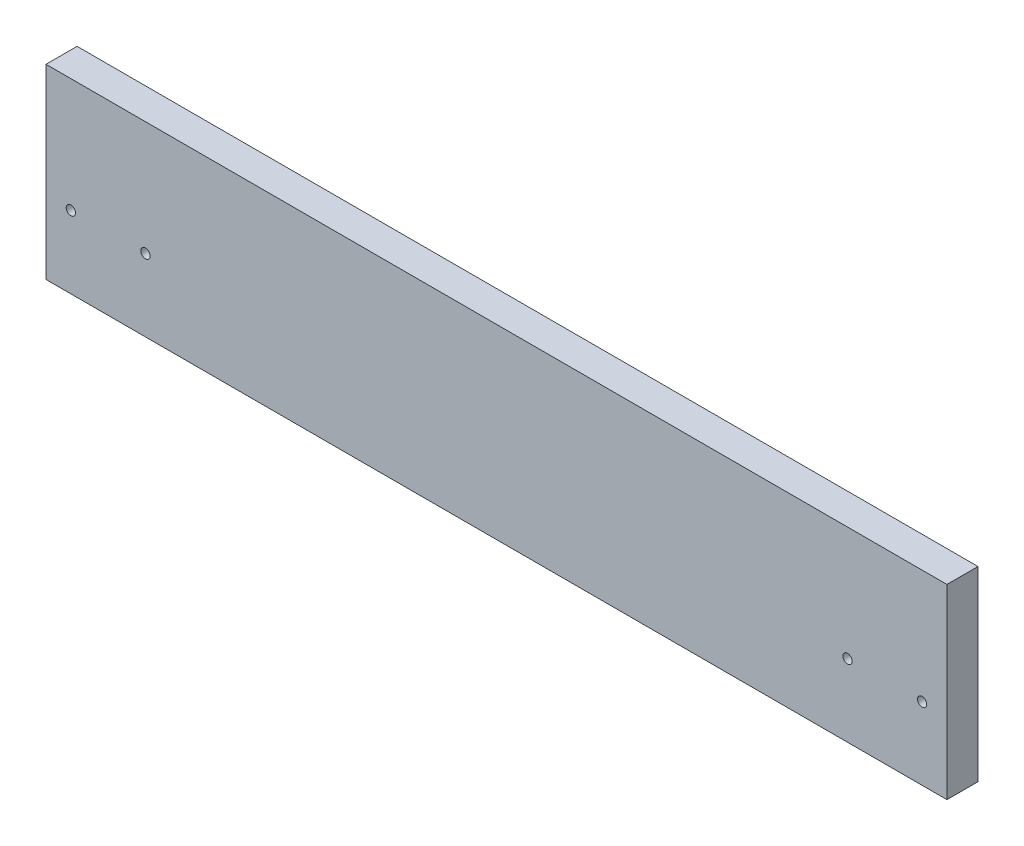
ISO-10303-21;
HEADER;
FILE_DESCRIPTION(('STEP AP214'),'2;1');
FILE_NAME('part.step','',(''),(''),'','','');
FILE_SCHEMA(('AUTOMOTIVE_DESIGN { 1 0 10303 214 1 1 1 1 }'));
ENDSEC;
DATA;
#1=APPLICATION_CONTEXT('core data for automotive mechanical design processes');
#2=APPLICATION_PROTOCOL_DEFINITION('international standard','automotive_design',2000,#1);
#3=PRODUCT_CONTEXT('',#1,'mechanical');
#4=PRODUCT('Part','Part','',(#3));
#5=PRODUCT_RELATED_PRODUCT_CATEGORY('part','',(#4));
#6=PRODUCT_DEFINITION_FORMATION('','',#4);
#7=PRODUCT_DEFINITION_CONTEXT('part definition',#1,'design');
#8=PRODUCT_DEFINITION('design','',#6,#7);
#9=PRODUCT_DEFINITION_SHAPE('','',#8);
#10=(LENGTH_UNIT() NAMED_UNIT(*) SI_UNIT(.MILLI.,.METRE.));
#11=(NAMED_UNIT(*) PLANE_ANGLE_UNIT() SI_UNIT($,.RADIAN.));
#12=(NAMED_UNIT(*) SI_UNIT($,.STERADIAN.) SOLID_ANGLE_UNIT());
#13=UNCERTAINTY_MEASURE_WITH_UNIT(LENGTH_MEASURE(1.E-05),#10,'distance_accuracy_value','');
#14=(GEOMETRIC_REPRESENTATION_CONTEXT(3) GLOBAL_UNCERTAINTY_ASSIGNED_CONTEXT((#13)) GLOBAL_UNIT_ASSIGNED_CONTEXT((#10,
#11,#12)) REPRESENTATION_CONTEXT('',''));
#15=CARTESIAN_POINT('',(0.,0.,0.));
#16=DIRECTION('',(0.,0.,1.));
#17=DIRECTION('',(1.,0.,0.));
#18=AXIS2_PLACEMENT_3D('',#15,#16,#17);
#19=CARTESIAN_POINT('',(0.,0.,10.));
#20=DIRECTION('',(1.,0.,0.));
#21=DIRECTION('',(0.,0.,-1.));
#22=AXIS2_PLACEMENT_3D('',#19,#20,#21);
#23=PLANE('',#22);
#24=DIRECTION('',(0.,-1.,0.));
#25=VECTOR('',#24,1.);
#26=CARTESIAN_POINT('',(0.,0.,0.));
#27=LINE('',#26,#25);
#28=CARTESIAN_POINT('',(0.,60.,0.));
#29=VERTEX_POINT('',#28);
#30=CARTESIAN_POINT('',(0.,0.,0.));
#31=VERTEX_POINT('',#30);
#32=EDGE_CURVE('E98',#29,#31,#27,.T.);
#33=ORIENTED_EDGE('',*,*,#32,.T.);
#34=DIRECTION('',(0.,0.,-1.));
#35=VECTOR('',#34,1.);
#36=CARTESIAN_POINT('',(0.,0.,10.));
#37=LINE('',#36,#35);
#38=CARTESIAN_POINT('',(0.,0.,10.));
#39=VERTEX_POINT('',#38);
#40=EDGE_CURVE('E11',#39,#31,#37,.T.);
#41=ORIENTED_EDGE('',*,*,#40,.F.);
#42=DIRECTION('',(0.,-1.,0.));
#43=VECTOR('',#42,1.);
#44=CARTESIAN_POINT('',(0.,0.,10.));
#45=LINE('',#44,#43);
#46=CARTESIAN_POINT('',(0.,60.,10.));
#47=VERTEX_POINT('',#46);
#48=EDGE_CURVE('E86',#47,#39,#45,.T.);
#49=ORIENTED_EDGE('',*,*,#48,.F.);
#50=DIRECTION('',(0.,0.,-1.));
#51=VECTOR('',#50,1.);
#52=CARTESIAN_POINT('',(0.,60.,10.));
#53=LINE('',#52,#51);
#54=EDGE_CURVE('E94',#47,#29,#53,.T.);
#55=ORIENTED_EDGE('',*,*,#54,.T.);
#56=EDGE_LOOP('',(#33,#41,#49,#55));
#57=FACE_BOUND('',#56,.T.);
#58=ADVANCED_FACE('F35',(#57),#23,.F.);
#59=CARTESIAN_POINT('',(0.,0.,10.));
#60=DIRECTION('',(0.,1.,0.));
#61=DIRECTION('',(0.,0.,1.));
#62=AXIS2_PLACEMENT_3D('',#59,#60,#61);
#63=PLANE('',#62);
#64=DIRECTION('',(1.,0.,0.));
#65=VECTOR('',#64,1.);
#66=CARTESIAN_POINT('',(0.,0.,0.));
#67=LINE('',#66,#65);
#68=CARTESIAN_POINT('',(290.,0.,0.));
#69=VERTEX_POINT('',#68);
#70=EDGE_CURVE('E90',#31,#69,#67,.T.);
#71=ORIENTED_EDGE('',*,*,#70,.T.);
#72=DIRECTION('',(0.,0.,-1.));
#73=VECTOR('',#72,1.);
#74=CARTESIAN_POINT('',(290.,0.,10.));
#75=LINE('',#74,#73);
#76=CARTESIAN_POINT('',(290.,0.,10.));
#77=VERTEX_POINT('',#76);
#78=EDGE_CURVE('E43',#77,#69,#75,.T.);
#79=ORIENTED_EDGE('',*,*,#78,.F.);
#80=DIRECTION('',(1.,0.,0.));
#81=VECTOR('',#80,1.);
#82=CARTESIAN_POINT('',(0.,0.,10.));
#83=LINE('',#82,#81);
#84=EDGE_CURVE('E81',#39,#77,#83,.T.);
#85=ORIENTED_EDGE('',*,*,#84,.F.);
#86=ORIENTED_EDGE('',*,*,#40,.T.);
#87=EDGE_LOOP('',(#71,#79,#85,#86));
#88=FACE_BOUND('',#87,.T.);
#89=ADVANCED_FACE('F89',(#88),#63,.F.);
#90=CARTESIAN_POINT('',(290.,0.,10.));
#91=DIRECTION('',(-1.,0.,0.));
#92=DIRECTION('',(0.,0.,1.));
#93=AXIS2_PLACEMENT_3D('',#90,#91,#92);
#94=PLANE('',#93);
#95=DIRECTION('',(0.,1.,0.));
#96=VECTOR('',#95,1.);
#97=CARTESIAN_POINT('',(290.,0.,0.));
#98=LINE('',#97,#96);
#99=CARTESIAN_POINT('',(290.,60.,0.));
#100=VERTEX_POINT('',#99);
#101=EDGE_CURVE('E68',#69,#100,#98,.T.);
#102=ORIENTED_EDGE('',*,*,#101,.T.);
#103=DIRECTION('',(0.,0.,-1.));
#104=VECTOR('',#103,1.);
#105=CARTESIAN_POINT('',(290.,60.,10.));
#106=LINE('',#105,#104);
#107=CARTESIAN_POINT('',(290.,60.,10.));
#108=VERTEX_POINT('',#107);
#109=EDGE_CURVE('E91',#108,#100,#106,.T.);
#110=ORIENTED_EDGE('',*,*,#109,.F.);
#111=DIRECTION('',(0.,1.,0.));
#112=VECTOR('',#111,1.);
#113=CARTESIAN_POINT('',(290.,0.,10.));
#114=LINE('',#113,#112);
#115=EDGE_CURVE('E84',#77,#108,#114,.T.);
#116=ORIENTED_EDGE('',*,*,#115,.F.);
#117=ORIENTED_EDGE('',*,*,#78,.T.);
#118=EDGE_LOOP('',(#102,#110,#116,#117));
#119=FACE_BOUND('',#118,.T.);
#120=ADVANCED_FACE('F92',(#119),#94,.F.);
#121=CARTESIAN_POINT('',(0.,60.,10.));
#122=DIRECTION('',(0.,-1.,0.));
#123=DIRECTION('',(0.,0.,-1.));
#124=AXIS2_PLACEMENT_3D('',#121,#122,#123);
#125=PLANE('',#124);
#126=DIRECTION('',(-1.,0.,0.));
#127=VECTOR('',#126,1.);
#128=CARTESIAN_POINT('',(0.,60.,0.));
#129=LINE('',#128,#127);
#130=EDGE_CURVE('E74',#100,#29,#129,.T.);
#131=ORIENTED_EDGE('',*,*,#130,.T.);
#132=ORIENTED_EDGE('',*,*,#54,.F.);
#133=DIRECTION('',(-1.,0.,0.));
#134=VECTOR('',#133,1.);
#135=CARTESIAN_POINT('',(0.,60.,10.));
#136=LINE('',#135,#134);
#137=EDGE_CURVE('E51',#108,#47,#136,.T.);
#138=ORIENTED_EDGE('',*,*,#137,.F.);
#139=ORIENTED_EDGE('',*,*,#109,.T.);
#140=EDGE_LOOP('',(#131,#132,#138,#139));
#141=FACE_BOUND('',#140,.T.);
#142=ADVANCED_FACE('F106',(#141),#125,.F.);
#143=CARTESIAN_POINT('',(0.,0.,10.));
#144=DIRECTION('',(0.,0.,-1.));
#145=DIRECTION('',(-1.,0.,0.));
#146=AXIS2_PLACEMENT_3D('',#143,#144,#145);
#147=PLANE('',#146);
#148=CARTESIAN_POINT('',(32.,23.291028808125,10.));
#149=DIRECTION('',(0.,0.,1.));
#150=DIRECTION('',(-1.,0.,0.));
#151=AXIS2_PLACEMENT_3D('',#148,#149,#150);
#152=CIRCLE('',#151,1.5);
#153=CARTESIAN_POINT('',(30.5,23.291028808125,10.));
#154=VERTEX_POINT('',#153);
#155=EDGE_CURVE('E130',#154,#154,#152,.T.);
#156=ORIENTED_EDGE('',*,*,#155,.F.);
#157=EDGE_LOOP('',(#156));
#158=FACE_BOUND('',#157,.T.);
#159=CARTESIAN_POINT('',(282.,23.291028808125,10.));
#160=DIRECTION('',(0.,0.,1.));
#161=DIRECTION('',(-1.,0.,0.));
#162=AXIS2_PLACEMENT_3D('',#159,#160,#161);
#163=CIRCLE('',#162,1.50000000000008);
#164=CARTESIAN_POINT('',(280.5,23.291028808125,10.));
#165=VERTEX_POINT('',#164);
#166=EDGE_CURVE('E124',#165,#165,#163,.T.);
#167=ORIENTED_EDGE('',*,*,#166,.F.);
#168=EDGE_LOOP('',(#167));
#169=FACE_BOUND('',#168,.T.);
#170=CARTESIAN_POINT('',(258.,23.291028808125,10.));
#171=DIRECTION('',(0.,0.,1.));
#172=DIRECTION('',(1.,0.,0.));
#173=AXIS2_PLACEMENT_3D('',#170,#171,#172);
#174=CIRCLE('',#173,1.50000000000002);
#175=CARTESIAN_POINT('',(259.5,23.291028808125,10.));
#176=VERTEX_POINT('',#175);
#177=EDGE_CURVE('E118',#176,#176,#174,.T.);
#178=ORIENTED_EDGE('',*,*,#177,.F.);
#179=EDGE_LOOP('',(#178));
#180=FACE_BOUND('',#179,.T.);
#181=CARTESIAN_POINT('',(7.99999999999999,23.291028808125,10.));
#182=DIRECTION('',(0.,0.,1.));
#183=DIRECTION('',(1.,0.,0.));
#184=AXIS2_PLACEMENT_3D('',#181,#182,#183);
#185=CIRCLE('',#184,1.5);
#186=CARTESIAN_POINT('',(9.49999999999999,23.291028808125,10.));
#187=VERTEX_POINT('',#186);
#188=EDGE_CURVE('E112',#187,#187,#185,.T.);
#189=ORIENTED_EDGE('',*,*,#188,.F.);
#190=EDGE_LOOP('',(#189));
#191=FACE_BOUND('',#190,.T.);
#192=ORIENTED_EDGE('',*,*,#48,.T.);
#193=ORIENTED_EDGE('',*,*,#84,.T.);
#194=ORIENTED_EDGE('',*,*,#115,.T.);
#195=ORIENTED_EDGE('',*,*,#137,.T.);
#196=EDGE_LOOP('',(#192,#193,#194,#195));
#197=FACE_BOUND('',#196,.T.);
#198=ADVANCED_FACE('F82',(#158,#169,#180,#191,#197),#147,.F.);
#199=CARTESIAN_POINT('',(0.,0.,0.));
#200=DIRECTION('',(0.,0.,-1.));
#201=DIRECTION('',(-1.,0.,0.));
#202=AXIS2_PLACEMENT_3D('',#199,#200,#201);
#203=PLANE('',#202);
#204=CARTESIAN_POINT('',(32.,23.291028808125,0.));
#205=DIRECTION('',(0.,0.,1.));
#206=DIRECTION('',(-1.,0.,0.));
#207=AXIS2_PLACEMENT_3D('',#204,#205,#206);
#208=CIRCLE('',#207,1.5);
#209=CARTESIAN_POINT('',(30.5,23.291028808125,0.));
#210=VERTEX_POINT('',#209);
#211=EDGE_CURVE('E115',#210,#210,#208,.T.);
#212=ORIENTED_EDGE('',*,*,#211,.T.);
#213=EDGE_LOOP('',(#212));
#214=FACE_BOUND('',#213,.T.);
#215=CARTESIAN_POINT('',(282.,23.291028808125,0.));
#216=DIRECTION('',(0.,0.,1.));
#217=DIRECTION('',(-1.,0.,0.));
#218=AXIS2_PLACEMENT_3D('',#215,#216,#217);
#219=CIRCLE('',#218,1.50000000000008);
#220=CARTESIAN_POINT('',(280.5,23.291028808125,0.));
#221=VERTEX_POINT('',#220);
#222=EDGE_CURVE('E127',#221,#221,#219,.T.);
#223=ORIENTED_EDGE('',*,*,#222,.T.);
#224=EDGE_LOOP('',(#223));
#225=FACE_BOUND('',#224,.T.);
#226=CARTESIAN_POINT('',(258.,23.291028808125,0.));
#227=DIRECTION('',(0.,0.,1.));
#228=DIRECTION('',(1.,0.,0.));
#229=AXIS2_PLACEMENT_3D('',#226,#227,#228);
#230=CIRCLE('',#229,1.50000000000002);
#231=CARTESIAN_POINT('',(259.5,23.291028808125,0.));
#232=VERTEX_POINT('',#231);
#233=EDGE_CURVE('E121',#232,#232,#230,.T.);
#234=ORIENTED_EDGE('',*,*,#233,.T.);
#235=EDGE_LOOP('',(#234));
#236=FACE_BOUND('',#235,.T.);
#237=CARTESIAN_POINT('',(7.99999999999999,23.291028808125,0.));
#238=DIRECTION('',(0.,0.,1.));
#239=DIRECTION('',(1.,0.,0.));
#240=AXIS2_PLACEMENT_3D('',#237,#238,#239);
#241=CIRCLE('',#240,1.5);
#242=CARTESIAN_POINT('',(9.49999999999999,23.291028808125,0.));
#243=VERTEX_POINT('',#242);
#244=EDGE_CURVE('E101',#243,#243,#241,.T.);
#245=ORIENTED_EDGE('',*,*,#244,.T.);
#246=EDGE_LOOP('',(#245));
#247=FACE_BOUND('',#246,.T.);
#248=ORIENTED_EDGE('',*,*,#32,.F.);
#249=ORIENTED_EDGE('',*,*,#130,.F.);
#250=ORIENTED_EDGE('',*,*,#101,.F.);
#251=ORIENTED_EDGE('',*,*,#70,.F.);
#252=EDGE_LOOP('',(#248,#249,#250,#251));
#253=FACE_BOUND('',#252,.T.);
#254=ADVANCED_FACE('F109',(#214,#225,#236,#247,#253),#203,.T.);
#255=CARTESIAN_POINT('',(7.99999999999999,23.291028808125,0.));
#256=DIRECTION('',(0.,0.,1.));
#257=DIRECTION('',(1.,0.,0.));
#258=AXIS2_PLACEMENT_3D('',#255,#256,#257);
#259=CYLINDRICAL_SURFACE('',#258,1.5);
#260=ORIENTED_EDGE('',*,*,#244,.F.);
#261=EDGE_LOOP('',(#260));
#262=FACE_BOUND('',#261,.T.);
#263=ORIENTED_EDGE('',*,*,#188,.T.);
#264=EDGE_LOOP('',(#263));
#265=FACE_BOUND('',#264,.T.);
#266=ADVANCED_FACE('F154',(#262,#265),#259,.F.);
#267=CARTESIAN_POINT('',(258.,23.291028808125,0.));
#268=DIRECTION('',(0.,0.,1.));
#269=DIRECTION('',(1.,0.,0.));
#270=AXIS2_PLACEMENT_3D('',#267,#268,#269);
#271=CYLINDRICAL_SURFACE('',#270,1.50000000000002);
#272=ORIENTED_EDGE('',*,*,#233,.F.);
#273=EDGE_LOOP('',(#272));
#274=FACE_BOUND('',#273,.T.);
#275=ORIENTED_EDGE('',*,*,#177,.T.);
#276=EDGE_LOOP('',(#275));
#277=FACE_BOUND('',#276,.T.);
#278=ADVANCED_FACE('F156',(#274,#277),#271,.F.);
#279=CARTESIAN_POINT('',(282.,23.291028808125,0.));
#280=DIRECTION('',(0.,0.,1.));
#281=DIRECTION('',(1.,0.,0.));
#282=AXIS2_PLACEMENT_3D('',#279,#280,#281);
#283=CYLINDRICAL_SURFACE('',#282,1.50000000000008);
#284=ORIENTED_EDGE('',*,*,#222,.F.);
#285=EDGE_LOOP('',(#284));
#286=FACE_BOUND('',#285,.T.);
#287=ORIENTED_EDGE('',*,*,#166,.T.);
#288=EDGE_LOOP('',(#287));
#289=FACE_BOUND('',#288,.T.);
#290=ADVANCED_FACE('F141',(#286,#289),#283,.F.);
#291=CARTESIAN_POINT('',(32.,23.291028808125,0.));
#292=DIRECTION('',(0.,0.,1.));
#293=DIRECTION('',(1.,0.,0.));
#294=AXIS2_PLACEMENT_3D('',#291,#292,#293);
#295=CYLINDRICAL_SURFACE('',#294,1.5);
#296=ORIENTED_EDGE('',*,*,#211,.F.);
#297=EDGE_LOOP('',(#296));
#298=FACE_BOUND('',#297,.T.);
#299=ORIENTED_EDGE('',*,*,#155,.T.);
#300=EDGE_LOOP('',(#299));
#301=FACE_BOUND('',#300,.T.);
#302=ADVANCED_FACE('F138',(#298,#301),#295,.F.);
#303=CLOSED_SHELL('',(#58,#89,#120,#142,#198,#254,#266,#278,#290,#302));
#304=MANIFOLD_SOLID_BREP('B2',#303);
#305=ADVANCED_BREP_SHAPE_REPRESENTATION('',(#18,#304),#14);
#306=SHAPE_DEFINITION_REPRESENTATION(#9,#305);
ENDSEC;
END-ISO-10303-21;
